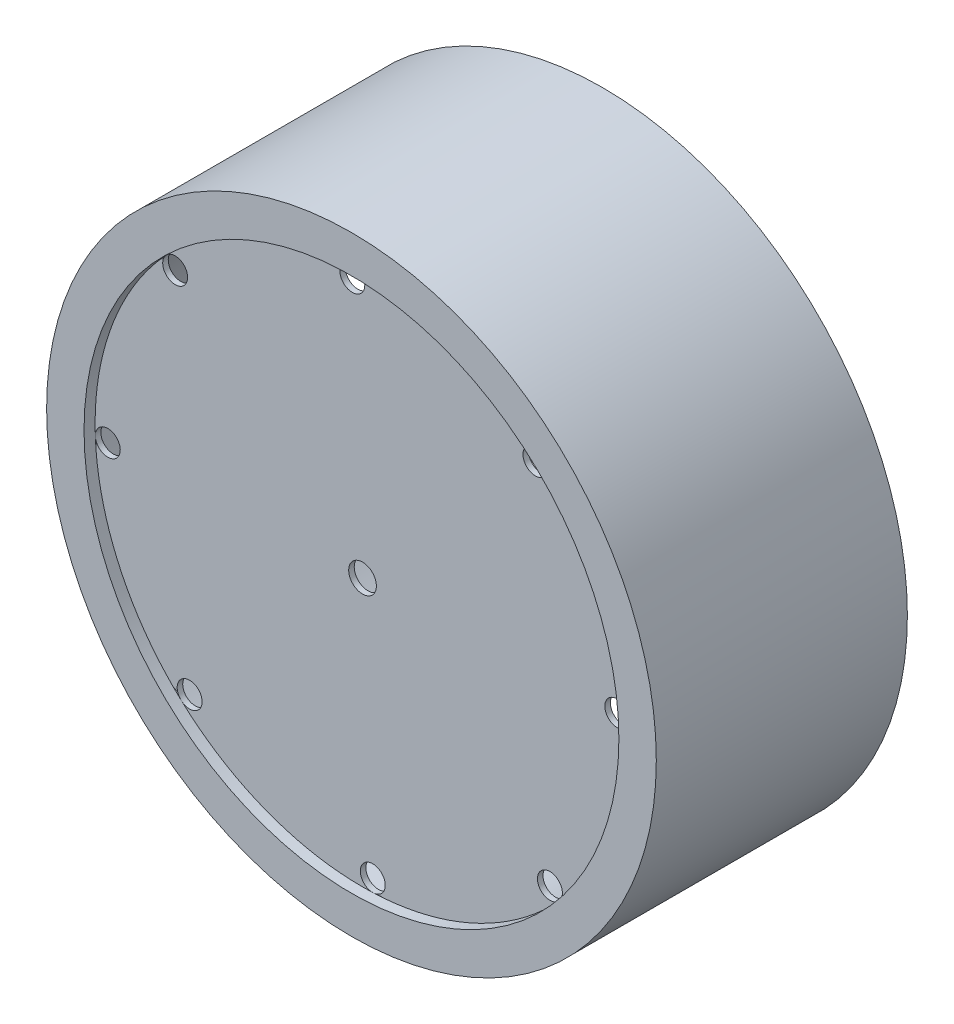
ISO-10303-21;
HEADER;
FILE_DESCRIPTION(('STEP AP214'),'2;1');
FILE_NAME('part.step','',(''),(''),'','','');
FILE_SCHEMA(('AUTOMOTIVE_DESIGN { 1 0 10303 214 1 1 1 1 }'));
ENDSEC;
DATA;
#1=APPLICATION_CONTEXT('core data for automotive mechanical design processes');
#2=APPLICATION_PROTOCOL_DEFINITION('international standard','automotive_design',2000,#1);
#3=PRODUCT_CONTEXT('',#1,'mechanical');
#4=PRODUCT('Part','Part','',(#3));
#5=PRODUCT_RELATED_PRODUCT_CATEGORY('part','',(#4));
#6=PRODUCT_DEFINITION_FORMATION('','',#4);
#7=PRODUCT_DEFINITION_CONTEXT('part definition',#1,'design');
#8=PRODUCT_DEFINITION('design','',#6,#7);
#9=PRODUCT_DEFINITION_SHAPE('','',#8);
#10=(LENGTH_UNIT() NAMED_UNIT(*) SI_UNIT(.MILLI.,.METRE.));
#11=(NAMED_UNIT(*) PLANE_ANGLE_UNIT() SI_UNIT($,.RADIAN.));
#12=(NAMED_UNIT(*) SI_UNIT($,.STERADIAN.) SOLID_ANGLE_UNIT());
#13=UNCERTAINTY_MEASURE_WITH_UNIT(LENGTH_MEASURE(1.E-05),#10,'distance_accuracy_value','');
#14=(GEOMETRIC_REPRESENTATION_CONTEXT(3) GLOBAL_UNCERTAINTY_ASSIGNED_CONTEXT((#13)) GLOBAL_UNIT_ASSIGNED_CONTEXT((#10,
#11,#12)) REPRESENTATION_CONTEXT('',''));
#15=CARTESIAN_POINT('',(0.,0.,0.));
#16=DIRECTION('',(0.,0.,1.));
#17=DIRECTION('',(1.,0.,0.));
#18=AXIS2_PLACEMENT_3D('',#15,#16,#17);
#19=CARTESIAN_POINT('',(0.,0.,45.3));
#20=DIRECTION('',(0.,0.,-1.));
#21=DIRECTION('',(-1.,0.,0.));
#22=AXIS2_PLACEMENT_3D('',#19,#20,#21);
#23=CYLINDRICAL_SURFACE('',#22,55.);
#24=CARTESIAN_POINT('',(0.,0.,45.3));
#25=DIRECTION('',(0.,0.,1.));
#26=DIRECTION('',(1.,0.,0.));
#27=AXIS2_PLACEMENT_3D('',#24,#25,#26);
#28=CIRCLE('',#27,55.);
#29=CARTESIAN_POINT('',(55.,0.,45.3));
#30=VERTEX_POINT('',#29);
#31=EDGE_CURVE('E11',#30,#30,#28,.T.);
#32=ORIENTED_EDGE('',*,*,#31,.F.);
#33=EDGE_LOOP('',(#32));
#34=FACE_BOUND('',#33,.T.);
#35=CARTESIAN_POINT('',(0.,0.,0.));
#36=DIRECTION('',(0.,0.,1.));
#37=DIRECTION('',(1.,0.,0.));
#38=AXIS2_PLACEMENT_3D('',#35,#36,#37);
#39=CIRCLE('',#38,55.);
#40=CARTESIAN_POINT('',(55.,0.,0.));
#41=VERTEX_POINT('',#40);
#42=EDGE_CURVE('E46',#41,#41,#39,.T.);
#43=ORIENTED_EDGE('',*,*,#42,.T.);
#44=EDGE_LOOP('',(#43));
#45=FACE_BOUND('',#44,.T.);
#46=ADVANCED_FACE('F38',(#34,#45),#23,.T.);
#47=CARTESIAN_POINT('',(0.,0.,45.3));
#48=DIRECTION('',(0.,0.,1.));
#49=DIRECTION('',(1.,0.,0.));
#50=AXIS2_PLACEMENT_3D('',#47,#48,#49);
#51=PLANE('',#50);
#52=CARTESIAN_POINT('',(0.,0.,45.3));
#53=DIRECTION('',(0.,0.,1.));
#54=DIRECTION('',(1.,0.,0.));
#55=AXIS2_PLACEMENT_3D('',#52,#53,#54);
#56=CIRCLE('',#55,48.25);
#57=CARTESIAN_POINT('',(48.25,0.,45.3));
#58=VERTEX_POINT('',#57);
#59=EDGE_CURVE('E95',#58,#58,#56,.T.);
#60=ORIENTED_EDGE('',*,*,#59,.F.);
#61=EDGE_LOOP('',(#60));
#62=FACE_BOUND('',#61,.T.);
#63=ORIENTED_EDGE('',*,*,#31,.T.);
#64=EDGE_LOOP('',(#63));
#65=FACE_BOUND('',#64,.T.);
#66=ADVANCED_FACE('F165',(#62,#65),#51,.T.);
#67=CARTESIAN_POINT('',(0.,0.,0.));
#68=DIRECTION('',(0.,0.,1.));
#69=DIRECTION('',(1.,0.,0.));
#70=AXIS2_PLACEMENT_3D('',#67,#68,#69);
#71=PLANE('',#70);
#72=CARTESIAN_POINT('',(0.,0.,0.));
#73=DIRECTION('',(0.,0.,-1.));
#74=DIRECTION('',(-1.,0.,0.));
#75=AXIS2_PLACEMENT_3D('',#72,#73,#74);
#76=CIRCLE('',#75,50.);
#77=CARTESIAN_POINT('',(-50.,0.,0.));
#78=VERTEX_POINT('',#77);
#79=EDGE_CURVE('E109',#78,#78,#76,.T.);
#80=ORIENTED_EDGE('',*,*,#79,.F.);
#81=EDGE_LOOP('',(#80));
#82=FACE_BOUND('',#81,.T.);
#83=ORIENTED_EDGE('',*,*,#42,.F.);
#84=EDGE_LOOP('',(#83));
#85=FACE_BOUND('',#84,.T.);
#86=ADVANCED_FACE('F159',(#82,#85),#71,.F.);
#87=CARTESIAN_POINT('',(0.,0.,42.3));
#88=DIRECTION('',(0.,0.,-1.));
#89=DIRECTION('',(-1.,0.,0.));
#90=AXIS2_PLACEMENT_3D('',#87,#88,#89);
#91=CYLINDRICAL_SURFACE('',#90,50.);
#92=CARTESIAN_POINT('',(0.,0.,42.3));
#93=DIRECTION('',(0.,0.,-1.));
#94=DIRECTION('',(-1.,0.,0.));
#95=AXIS2_PLACEMENT_3D('',#92,#93,#94);
#96=CIRCLE('',#95,50.);
#97=CARTESIAN_POINT('',(-50.,0.,42.3));
#98=VERTEX_POINT('',#97);
#99=EDGE_CURVE('E106',#98,#98,#96,.T.);
#100=ORIENTED_EDGE('',*,*,#99,.F.);
#101=EDGE_LOOP('',(#100));
#102=FACE_BOUND('',#101,.T.);
#103=ORIENTED_EDGE('',*,*,#79,.T.);
#104=EDGE_LOOP('',(#103));
#105=FACE_BOUND('',#104,.T.);
#106=ADVANCED_FACE('F148',(#102,#105),#91,.F.);
#107=CARTESIAN_POINT('',(0.,0.,42.3));
#108=DIRECTION('',(0.,0.,-1.));
#109=DIRECTION('',(-1.,0.,0.));
#110=AXIS2_PLACEMENT_3D('',#107,#108,#109);
#111=PLANE('',#110);
#112=CARTESIAN_POINT('',(0.,0.,42.3));
#113=DIRECTION('',(0.,0.,-1.));
#114=DIRECTION('',(-1.,0.,0.));
#115=AXIS2_PLACEMENT_3D('',#112,#113,#114);
#116=CIRCLE('',#115,2.5);
#117=CARTESIAN_POINT('',(-2.5,0.,42.3));
#118=VERTEX_POINT('',#117);
#119=EDGE_CURVE('E126',#118,#118,#116,.T.);
#120=ORIENTED_EDGE('',*,*,#119,.F.);
#121=EDGE_LOOP('',(#120));
#122=FACE_BOUND('',#121,.T.);
#123=CARTESIAN_POINT('',(1.84762445308254,-45.9628794124168,42.3));
#124=DIRECTION('',(0.,0.,-1.));
#125=DIRECTION('',(-1.,0.,0.));
#126=AXIS2_PLACEMENT_3D('',#123,#124,#125);
#127=CIRCLE('',#126,2.25);
#128=CARTESIAN_POINT('',(-0.402375546917464,-45.9628794124168,42.3));
#129=VERTEX_POINT('',#128);
#130=EDGE_CURVE('E113',#129,#129,#127,.T.);
#131=ORIENTED_EDGE('',*,*,#130,.F.);
#132=EDGE_LOOP('',(#131));
#133=FACE_BOUND('',#132,.T.);
#134=CARTESIAN_POINT('',(-45.9628794124168,-1.84762445308301,42.3));
#135=DIRECTION('',(0.,0.,-1.));
#136=DIRECTION('',(-1.,0.,0.));
#137=AXIS2_PLACEMENT_3D('',#134,#135,#136);
#138=CIRCLE('',#137,2.25);
#139=CARTESIAN_POINT('',(-48.2128794124168,-1.84762445308301,42.3));
#140=VERTEX_POINT('',#139);
#141=EDGE_CURVE('E134',#140,#140,#138,.T.);
#142=ORIENTED_EDGE('',*,*,#141,.F.);
#143=EDGE_LOOP('',(#142));
#144=FACE_BOUND('',#143,.T.);
#145=CARTESIAN_POINT('',(-33.8071314952405,31.1941959355185,42.3));
#146=DIRECTION('',(0.,0.,-1.));
#147=DIRECTION('',(-1.,0.,0.));
#148=AXIS2_PLACEMENT_3D('',#145,#146,#147);
#149=CIRCLE('',#148,2.25);
#150=CARTESIAN_POINT('',(-36.0571314952405,31.1941959355185,42.3));
#151=VERTEX_POINT('',#150);
#152=EDGE_CURVE('E131',#151,#151,#149,.T.);
#153=ORIENTED_EDGE('',*,*,#152,.F.);
#154=EDGE_LOOP('',(#153));
#155=FACE_BOUND('',#154,.T.);
#156=CARTESIAN_POINT('',(-1.84762445308287,45.9628794124168,42.3));
#157=DIRECTION('',(0.,0.,-1.));
#158=DIRECTION('',(-1.,0.,0.));
#159=AXIS2_PLACEMENT_3D('',#156,#157,#158);
#160=CIRCLE('',#159,2.25);
#161=CARTESIAN_POINT('',(-4.09762445308287,45.9628794124168,42.3));
#162=VERTEX_POINT('',#161);
#163=EDGE_CURVE('E127',#162,#162,#160,.T.);
#164=ORIENTED_EDGE('',*,*,#163,.F.);
#165=EDGE_LOOP('',(#164));
#166=FACE_BOUND('',#165,.T.);
#167=CARTESIAN_POINT('',(33.8071314952403,-31.1941959355187,42.3));
#168=DIRECTION('',(0.,0.,-1.));
#169=DIRECTION('',(-1.,0.,0.));
#170=AXIS2_PLACEMENT_3D('',#167,#168,#169);
#171=CIRCLE('',#170,2.25);
#172=CARTESIAN_POINT('',(31.5571314952403,-31.1941959355187,42.3));
#173=VERTEX_POINT('',#172);
#174=EDGE_CURVE('E117',#173,#173,#171,.T.);
#175=ORIENTED_EDGE('',*,*,#174,.F.);
#176=EDGE_LOOP('',(#175));
#177=FACE_BOUND('',#176,.T.);
#178=CARTESIAN_POINT('',(45.9628794124168,1.8476244530827,42.3));
#179=DIRECTION('',(0.,0.,-1.));
#180=DIRECTION('',(-1.,0.,0.));
#181=AXIS2_PLACEMENT_3D('',#178,#179,#180);
#182=CIRCLE('',#181,2.25000000000001);
#183=CARTESIAN_POINT('',(43.7128794124168,1.8476244530827,42.3));
#184=VERTEX_POINT('',#183);
#185=EDGE_CURVE('E122',#184,#184,#182,.T.);
#186=ORIENTED_EDGE('',*,*,#185,.F.);
#187=EDGE_LOOP('',(#186));
#188=FACE_BOUND('',#187,.T.);
#189=CARTESIAN_POINT('',(31.1941959355186,33.8071314952404,42.3));
#190=DIRECTION('',(0.,0.,-1.));
#191=DIRECTION('',(-1.,0.,0.));
#192=AXIS2_PLACEMENT_3D('',#189,#190,#191);
#193=CIRCLE('',#192,2.25);
#194=CARTESIAN_POINT('',(28.9441959355186,33.8071314952404,42.3));
#195=VERTEX_POINT('',#194);
#196=EDGE_CURVE('E137',#195,#195,#193,.T.);
#197=ORIENTED_EDGE('',*,*,#196,.F.);
#198=EDGE_LOOP('',(#197));
#199=FACE_BOUND('',#198,.T.);
#200=CARTESIAN_POINT('',(-31.1941959355188,-33.8071314952402,42.3));
#201=DIRECTION('',(0.,0.,-1.));
#202=DIRECTION('',(-1.,0.,0.));
#203=AXIS2_PLACEMENT_3D('',#200,#201,#202);
#204=CIRCLE('',#203,2.25);
#205=CARTESIAN_POINT('',(-33.4441959355188,-33.8071314952402,42.3));
#206=VERTEX_POINT('',#205);
#207=EDGE_CURVE('E130',#206,#206,#204,.T.);
#208=ORIENTED_EDGE('',*,*,#207,.F.);
#209=EDGE_LOOP('',(#208));
#210=FACE_BOUND('',#209,.T.);
#211=ORIENTED_EDGE('',*,*,#99,.T.);
#212=EDGE_LOOP('',(#211));
#213=FACE_BOUND('',#212,.T.);
#214=ADVANCED_FACE('F144',(#122,#133,#144,#155,#166,#177,#188,#199,#210,#213),#111,.T.);
#215=CARTESIAN_POINT('',(0.,0.,43.3));
#216=DIRECTION('',(0.,0.,1.));
#217=DIRECTION('',(1.,0.,0.));
#218=AXIS2_PLACEMENT_3D('',#215,#216,#217);
#219=CYLINDRICAL_SURFACE('',#218,48.25);
#220=CARTESIAN_POINT('',(0.,0.,43.3));
#221=DIRECTION('',(0.,0.,1.));
#222=DIRECTION('',(1.,0.,0.));
#223=AXIS2_PLACEMENT_3D('',#220,#221,#222);
#224=CIRCLE('',#223,48.25);
#225=CARTESIAN_POINT('',(1.93799738828766,-48.2110637315024,43.3));
#226=VERTEX_POINT('',#225);
#227=CARTESIAN_POINT('',(35.4607411879423,-32.7199989975821,43.3));
#228=VERTEX_POINT('',#227);
#229=EDGE_CURVE('E101',#226,#228,#224,.T.);
#230=ORIENTED_EDGE('',*,*,#229,.F.);
#231=CARTESIAN_POINT('',(-32.7199989975822,-35.4607411879422,43.3));
#232=VERTEX_POINT('',#231);
#233=EDGE_CURVE('E239',#232,#226,#224,.T.);
#234=ORIENTED_EDGE('',*,*,#233,.F.);
#235=CARTESIAN_POINT('',(-48.2110637315024,-1.93799738828816,43.3));
#236=VERTEX_POINT('',#235);
#237=EDGE_CURVE('E244',#236,#232,#224,.T.);
#238=ORIENTED_EDGE('',*,*,#237,.F.);
#239=CARTESIAN_POINT('',(-35.4607411879425,32.7199989975819,43.3));
#240=VERTEX_POINT('',#239);
#241=EDGE_CURVE('E245',#240,#236,#224,.T.);
#242=ORIENTED_EDGE('',*,*,#241,.F.);
#243=CARTESIAN_POINT('',(-1.93799738828801,48.2110637315024,43.3));
#244=VERTEX_POINT('',#243);
#245=EDGE_CURVE('E253',#244,#240,#224,.T.);
#246=ORIENTED_EDGE('',*,*,#245,.F.);
#247=CARTESIAN_POINT('',(32.719998997582,35.4607411879424,43.3));
#248=VERTEX_POINT('',#247);
#249=EDGE_CURVE('E251',#248,#244,#224,.T.);
#250=ORIENTED_EDGE('',*,*,#249,.F.);
#251=CARTESIAN_POINT('',(48.2110637315024,1.93799738828784,43.3));
#252=VERTEX_POINT('',#251);
#253=EDGE_CURVE('E103',#252,#248,#224,.T.);
#254=ORIENTED_EDGE('',*,*,#253,.F.);
#255=EDGE_CURVE('E97',#228,#252,#224,.T.);
#256=ORIENTED_EDGE('',*,*,#255,.F.);
#257=EDGE_LOOP('',(#230,#234,#238,#242,#246,#250,#254,#256));
#258=FACE_BOUND('',#257,.T.);
#259=ORIENTED_EDGE('',*,*,#59,.T.);
#260=EDGE_LOOP('',(#259));
#261=FACE_BOUND('',#260,.T.);
#262=ADVANCED_FACE('F147',(#258,#261),#219,.F.);
#263=CARTESIAN_POINT('',(0.,0.,43.3));
#264=DIRECTION('',(0.,0.,1.));
#265=DIRECTION('',(1.,0.,0.));
#266=AXIS2_PLACEMENT_3D('',#263,#264,#265);
#267=PLANE('',#266);
#268=CARTESIAN_POINT('',(0.,0.,43.3));
#269=DIRECTION('',(0.,0.,1.));
#270=DIRECTION('',(1.,0.,0.));
#271=AXIS2_PLACEMENT_3D('',#268,#269,#270);
#272=CIRCLE('',#271,2.5);
#273=CARTESIAN_POINT('',(2.5,0.,43.3));
#274=VERTEX_POINT('',#273);
#275=EDGE_CURVE('E41',#274,#274,#272,.T.);
#276=ORIENTED_EDGE('',*,*,#275,.F.);
#277=EDGE_LOOP('',(#276));
#278=FACE_BOUND('',#277,.T.);
#279=ORIENTED_EDGE('',*,*,#233,.T.);
#280=CARTESIAN_POINT('',(1.84762445308254,-45.9628794124168,43.3));
#281=DIRECTION('',(0.,0.,1.));
#282=DIRECTION('',(1.,0.,0.));
#283=AXIS2_PLACEMENT_3D('',#280,#281,#282);
#284=CIRCLE('',#283,2.25);
#285=EDGE_CURVE('E57',#226,#226,#284,.T.);
#286=ORIENTED_EDGE('',*,*,#285,.F.);
#287=ORIENTED_EDGE('',*,*,#229,.T.);
#288=CARTESIAN_POINT('',(33.8071314952403,-31.1941959355187,43.3));
#289=DIRECTION('',(0.,0.,1.));
#290=DIRECTION('',(1.,0.,0.));
#291=AXIS2_PLACEMENT_3D('',#288,#289,#290);
#292=CIRCLE('',#291,2.25);
#293=EDGE_CURVE('E52',#228,#228,#292,.T.);
#294=ORIENTED_EDGE('',*,*,#293,.F.);
#295=ORIENTED_EDGE('',*,*,#255,.T.);
#296=CARTESIAN_POINT('',(45.9628794124168,1.8476244530827,43.3));
#297=DIRECTION('',(0.,0.,1.));
#298=DIRECTION('',(1.,0.,0.));
#299=AXIS2_PLACEMENT_3D('',#296,#297,#298);
#300=CIRCLE('',#299,2.25000000000001);
#301=EDGE_CURVE('E77',#252,#252,#300,.T.);
#302=ORIENTED_EDGE('',*,*,#301,.F.);
#303=ORIENTED_EDGE('',*,*,#253,.T.);
#304=CARTESIAN_POINT('',(31.1941959355186,33.8071314952404,43.3));
#305=DIRECTION('',(0.,0.,1.));
#306=DIRECTION('',(1.,0.,0.));
#307=AXIS2_PLACEMENT_3D('',#304,#305,#306);
#308=CIRCLE('',#307,2.25);
#309=EDGE_CURVE('E83',#248,#248,#308,.T.);
#310=ORIENTED_EDGE('',*,*,#309,.F.);
#311=ORIENTED_EDGE('',*,*,#249,.T.);
#312=CARTESIAN_POINT('',(-1.84762445308287,45.9628794124168,43.3));
#313=DIRECTION('',(0.,0.,1.));
#314=DIRECTION('',(1.,0.,0.));
#315=AXIS2_PLACEMENT_3D('',#312,#313,#314);
#316=CIRCLE('',#315,2.25);
#317=EDGE_CURVE('E85',#244,#244,#316,.T.);
#318=ORIENTED_EDGE('',*,*,#317,.F.);
#319=ORIENTED_EDGE('',*,*,#245,.T.);
#320=CARTESIAN_POINT('',(-33.8071314952405,31.1941959355185,43.3));
#321=DIRECTION('',(0.,0.,1.));
#322=DIRECTION('',(1.,0.,0.));
#323=AXIS2_PLACEMENT_3D('',#320,#321,#322);
#324=CIRCLE('',#323,2.25);
#325=EDGE_CURVE('E92',#240,#240,#324,.T.);
#326=ORIENTED_EDGE('',*,*,#325,.F.);
#327=ORIENTED_EDGE('',*,*,#241,.T.);
#328=CARTESIAN_POINT('',(-45.9628794124168,-1.84762445308301,43.3));
#329=DIRECTION('',(0.,0.,1.));
#330=DIRECTION('',(1.,0.,0.));
#331=AXIS2_PLACEMENT_3D('',#328,#329,#330);
#332=CIRCLE('',#331,2.25);
#333=EDGE_CURVE('E94',#236,#236,#332,.T.);
#334=ORIENTED_EDGE('',*,*,#333,.F.);
#335=ORIENTED_EDGE('',*,*,#237,.T.);
#336=CARTESIAN_POINT('',(-31.1941959355188,-33.8071314952402,43.3));
#337=DIRECTION('',(0.,0.,1.));
#338=DIRECTION('',(1.,0.,0.));
#339=AXIS2_PLACEMENT_3D('',#336,#337,#338);
#340=CIRCLE('',#339,2.25);
#341=EDGE_CURVE('E87',#232,#232,#340,.T.);
#342=ORIENTED_EDGE('',*,*,#341,.F.);
#343=EDGE_LOOP('',(#279,#286,#287,#294,#295,#302,#303,#310,#311,#318,#319,#326,#327,#334,#335,#342));
#344=FACE_BOUND('',#343,.T.);
#345=ADVANCED_FACE('F182',(#278,#344),#267,.T.);
#346=CARTESIAN_POINT('',(-31.1941959355188,-33.8071314952402,44.3));
#347=DIRECTION('',(0.,0.,-1.));
#348=DIRECTION('',(-1.,0.,0.));
#349=AXIS2_PLACEMENT_3D('',#346,#347,#348);
#350=CYLINDRICAL_SURFACE('',#349,2.25);
#351=ORIENTED_EDGE('',*,*,#341,.T.);
#352=EDGE_LOOP('',(#351));
#353=FACE_BOUND('',#352,.T.);
#354=ORIENTED_EDGE('',*,*,#207,.T.);
#355=EDGE_LOOP('',(#354));
#356=FACE_BOUND('',#355,.T.);
#357=ADVANCED_FACE('F186',(#353,#356),#350,.F.);
#358=CARTESIAN_POINT('',(31.1941959355186,33.8071314952404,44.3));
#359=DIRECTION('',(0.,0.,-1.));
#360=DIRECTION('',(-1.,0.,0.));
#361=AXIS2_PLACEMENT_3D('',#358,#359,#360);
#362=CYLINDRICAL_SURFACE('',#361,2.25);
#363=ORIENTED_EDGE('',*,*,#309,.T.);
#364=EDGE_LOOP('',(#363));
#365=FACE_BOUND('',#364,.T.);
#366=ORIENTED_EDGE('',*,*,#196,.T.);
#367=EDGE_LOOP('',(#366));
#368=FACE_BOUND('',#367,.T.);
#369=ADVANCED_FACE('F191',(#365,#368),#362,.F.);
#370=CARTESIAN_POINT('',(45.9628794124168,1.8476244530827,44.3));
#371=DIRECTION('',(0.,0.,-1.));
#372=DIRECTION('',(-1.,0.,0.));
#373=AXIS2_PLACEMENT_3D('',#370,#371,#372);
#374=CYLINDRICAL_SURFACE('',#373,2.25000000000001);
#375=ORIENTED_EDGE('',*,*,#301,.T.);
#376=EDGE_LOOP('',(#375));
#377=FACE_BOUND('',#376,.T.);
#378=ORIENTED_EDGE('',*,*,#185,.T.);
#379=EDGE_LOOP('',(#378));
#380=FACE_BOUND('',#379,.T.);
#381=ADVANCED_FACE('F78',(#377,#380),#374,.F.);
#382=CARTESIAN_POINT('',(33.8071314952403,-31.1941959355187,44.3));
#383=DIRECTION('',(0.,0.,-1.));
#384=DIRECTION('',(-1.,0.,0.));
#385=AXIS2_PLACEMENT_3D('',#382,#383,#384);
#386=CYLINDRICAL_SURFACE('',#385,2.25);
#387=ORIENTED_EDGE('',*,*,#293,.T.);
#388=EDGE_LOOP('',(#387));
#389=FACE_BOUND('',#388,.T.);
#390=ORIENTED_EDGE('',*,*,#174,.T.);
#391=EDGE_LOOP('',(#390));
#392=FACE_BOUND('',#391,.T.);
#393=ADVANCED_FACE('F190',(#389,#392),#386,.F.);
#394=CARTESIAN_POINT('',(-1.84762445308287,45.9628794124168,44.3));
#395=DIRECTION('',(0.,0.,-1.));
#396=DIRECTION('',(-1.,0.,0.));
#397=AXIS2_PLACEMENT_3D('',#394,#395,#396);
#398=CYLINDRICAL_SURFACE('',#397,2.25);
#399=ORIENTED_EDGE('',*,*,#317,.T.);
#400=EDGE_LOOP('',(#399));
#401=FACE_BOUND('',#400,.T.);
#402=ORIENTED_EDGE('',*,*,#163,.T.);
#403=EDGE_LOOP('',(#402));
#404=FACE_BOUND('',#403,.T.);
#405=ADVANCED_FACE('F194',(#401,#404),#398,.F.);
#406=CARTESIAN_POINT('',(-33.8071314952405,31.1941959355185,44.3));
#407=DIRECTION('',(0.,0.,-1.));
#408=DIRECTION('',(-1.,0.,0.));
#409=AXIS2_PLACEMENT_3D('',#406,#407,#408);
#410=CYLINDRICAL_SURFACE('',#409,2.25);
#411=ORIENTED_EDGE('',*,*,#325,.T.);
#412=EDGE_LOOP('',(#411));
#413=FACE_BOUND('',#412,.T.);
#414=ORIENTED_EDGE('',*,*,#152,.T.);
#415=EDGE_LOOP('',(#414));
#416=FACE_BOUND('',#415,.T.);
#417=ADVANCED_FACE('F204',(#413,#416),#410,.F.);
#418=CARTESIAN_POINT('',(-45.9628794124168,-1.84762445308301,44.3));
#419=DIRECTION('',(0.,0.,-1.));
#420=DIRECTION('',(-1.,0.,0.));
#421=AXIS2_PLACEMENT_3D('',#418,#419,#420);
#422=CYLINDRICAL_SURFACE('',#421,2.25);
#423=ORIENTED_EDGE('',*,*,#333,.T.);
#424=EDGE_LOOP('',(#423));
#425=FACE_BOUND('',#424,.T.);
#426=ORIENTED_EDGE('',*,*,#141,.T.);
#427=EDGE_LOOP('',(#426));
#428=FACE_BOUND('',#427,.T.);
#429=ADVANCED_FACE('F200',(#425,#428),#422,.F.);
#430=CARTESIAN_POINT('',(1.84762445308254,-45.9628794124168,44.3));
#431=DIRECTION('',(0.,0.,-1.));
#432=DIRECTION('',(-1.,0.,0.));
#433=AXIS2_PLACEMENT_3D('',#430,#431,#432);
#434=CYLINDRICAL_SURFACE('',#433,2.25);
#435=ORIENTED_EDGE('',*,*,#285,.T.);
#436=EDGE_LOOP('',(#435));
#437=FACE_BOUND('',#436,.T.);
#438=ORIENTED_EDGE('',*,*,#130,.T.);
#439=EDGE_LOOP('',(#438));
#440=FACE_BOUND('',#439,.T.);
#441=ADVANCED_FACE('F203',(#437,#440),#434,.F.);
#442=CARTESIAN_POINT('',(0.,0.,47.3));
#443=DIRECTION('',(0.,0.,-1.));
#444=DIRECTION('',(-1.,0.,0.));
#445=AXIS2_PLACEMENT_3D('',#442,#443,#444);
#446=CYLINDRICAL_SURFACE('',#445,2.5);
#447=ORIENTED_EDGE('',*,*,#275,.T.);
#448=EDGE_LOOP('',(#447));
#449=FACE_BOUND('',#448,.T.);
#450=ORIENTED_EDGE('',*,*,#119,.T.);
#451=EDGE_LOOP('',(#450));
#452=FACE_BOUND('',#451,.T.);
#453=ADVANCED_FACE('F214',(#449,#452),#446,.F.);
#454=CLOSED_SHELL('',(#46,#66,#86,#106,#214,#262,#345,#357,#369,#381,#393,#405,#417,#429,#441,#453));
#455=MANIFOLD_SOLID_BREP('B2',#454);
#456=ADVANCED_BREP_SHAPE_REPRESENTATION('',(#18,#455),#14);
#457=SHAPE_DEFINITION_REPRESENTATION(#9,#456);
ENDSEC;
END-ISO-10303-21;
